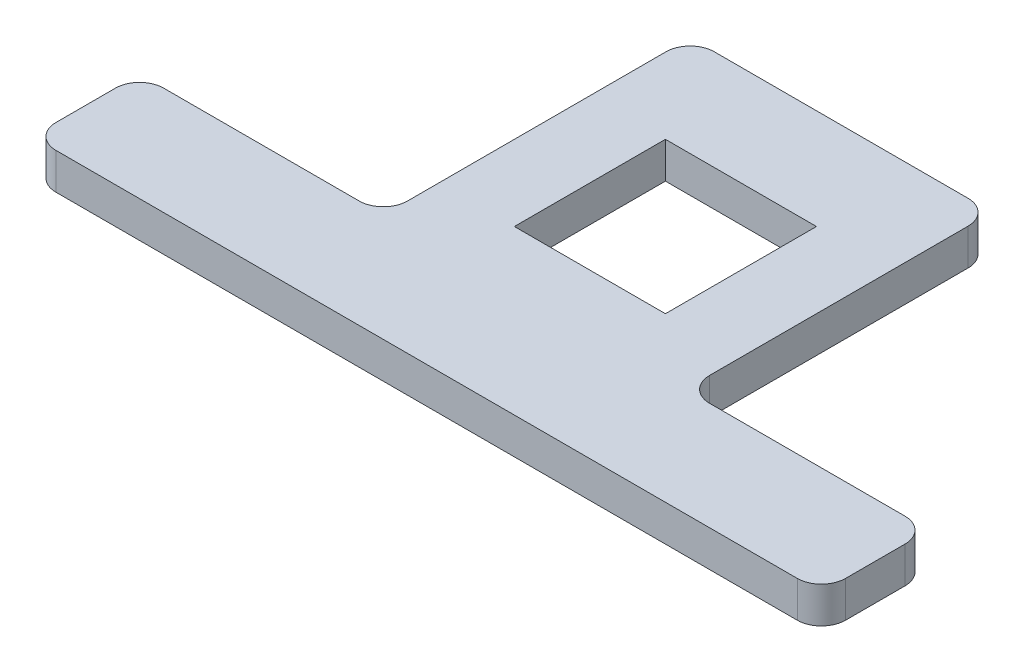
ISO-10303-21;
HEADER;
FILE_DESCRIPTION(('STEP AP214'),'2;1');
FILE_NAME('part.step','',(''),(''),'','','');
FILE_SCHEMA(('AUTOMOTIVE_DESIGN { 1 0 10303 214 1 1 1 1 }'));
ENDSEC;
DATA;
#1=APPLICATION_CONTEXT('core data for automotive mechanical design processes');
#2=APPLICATION_PROTOCOL_DEFINITION('international standard','automotive_design',2000,#1);
#3=PRODUCT_CONTEXT('',#1,'mechanical');
#4=PRODUCT('Part','Part','',(#3));
#5=PRODUCT_RELATED_PRODUCT_CATEGORY('part','',(#4));
#6=PRODUCT_DEFINITION_FORMATION('','',#4);
#7=PRODUCT_DEFINITION_CONTEXT('part definition',#1,'design');
#8=PRODUCT_DEFINITION('design','',#6,#7);
#9=PRODUCT_DEFINITION_SHAPE('','',#8);
#10=(LENGTH_UNIT() NAMED_UNIT(*) SI_UNIT(.MILLI.,.METRE.));
#11=(NAMED_UNIT(*) PLANE_ANGLE_UNIT() SI_UNIT($,.RADIAN.));
#12=(NAMED_UNIT(*) SI_UNIT($,.STERADIAN.) SOLID_ANGLE_UNIT());
#13=UNCERTAINTY_MEASURE_WITH_UNIT(LENGTH_MEASURE(1.E-05),#10,'distance_accuracy_value','');
#14=(GEOMETRIC_REPRESENTATION_CONTEXT(3) GLOBAL_UNCERTAINTY_ASSIGNED_CONTEXT((#13)) GLOBAL_UNIT_ASSIGNED_CONTEXT((#10,
#11,#12)) REPRESENTATION_CONTEXT('',''));
#15=CARTESIAN_POINT('',(0.,0.,0.));
#16=DIRECTION('',(0.,0.,1.));
#17=DIRECTION('',(1.,0.,0.));
#18=AXIS2_PLACEMENT_3D('',#15,#16,#17);
#19=CARTESIAN_POINT('',(65.35,6.,34.3099999999999));
#20=DIRECTION('',(-1.,0.,0.));
#21=DIRECTION('',(0.,0.,1.));
#22=AXIS2_PLACEMENT_3D('',#19,#20,#21);
#23=PLANE('',#22);
#24=DIRECTION('',(0.,0.,-1.));
#25=VECTOR('',#24,1.);
#26=CARTESIAN_POINT('',(65.35,0.,34.3099999999999));
#27=LINE('',#26,#25);
#28=CARTESIAN_POINT('',(65.35,0.,30.3099999999999));
#29=VERTEX_POINT('',#28);
#30=CARTESIAN_POINT('',(65.35,0.,20.4699999999999));
#31=VERTEX_POINT('',#30);
#32=EDGE_CURVE('E222',#29,#31,#27,.T.);
#33=ORIENTED_EDGE('',*,*,#32,.T.);
#34=DIRECTION('',(0.,-1.,0.));
#35=VECTOR('',#34,1.);
#36=CARTESIAN_POINT('',(65.35,6.,20.4699999999999));
#37=LINE('',#36,#35);
#38=CARTESIAN_POINT('',(65.35,6.,20.4699999999999));
#39=VERTEX_POINT('',#38);
#40=EDGE_CURVE('E327',#31,#39,#37,.F.);
#41=ORIENTED_EDGE('',*,*,#40,.T.);
#42=DIRECTION('',(0.,0.,-1.));
#43=VECTOR('',#42,1.);
#44=CARTESIAN_POINT('',(65.35,6.,34.3099999999999));
#45=LINE('',#44,#43);
#46=CARTESIAN_POINT('',(65.35,6.,30.3099999999999));
#47=VERTEX_POINT('',#46);
#48=EDGE_CURVE('E228',#47,#39,#45,.T.);
#49=ORIENTED_EDGE('',*,*,#48,.F.);
#50=DIRECTION('',(0.,-1.,0.));
#51=VECTOR('',#50,1.);
#52=CARTESIAN_POINT('',(65.35,6.,30.3099999999999));
#53=LINE('',#52,#51);
#54=EDGE_CURVE('E323',#47,#29,#53,.T.);
#55=ORIENTED_EDGE('',*,*,#54,.T.);
#56=EDGE_LOOP('',(#33,#41,#49,#55));
#57=FACE_BOUND('',#56,.T.);
#58=ADVANCED_FACE('F42',(#57),#23,.F.);
#59=CARTESIAN_POINT('',(25.,6.,16.4699999999999));
#60=DIRECTION('',(0.,0.,1.));
#61=DIRECTION('',(1.,0.,0.));
#62=AXIS2_PLACEMENT_3D('',#59,#60,#61);
#63=PLANE('',#62);
#64=DIRECTION('',(-1.,0.,0.));
#65=VECTOR('',#64,1.);
#66=CARTESIAN_POINT('',(25.,0.,16.4699999999999));
#67=LINE('',#66,#65);
#68=CARTESIAN_POINT('',(61.35,0.,16.4699999999999));
#69=VERTEX_POINT('',#68);
#70=CARTESIAN_POINT('',(29.,0.,16.4699999999999));
#71=VERTEX_POINT('',#70);
#72=EDGE_CURVE('E265',#69,#71,#67,.T.);
#73=ORIENTED_EDGE('',*,*,#72,.T.);
#74=DIRECTION('',(0.,-1.,0.));
#75=VECTOR('',#74,1.);
#76=CARTESIAN_POINT('',(29.,6.,16.4699999999999));
#77=LINE('',#76,#75);
#78=CARTESIAN_POINT('',(29.,6.,16.4699999999999));
#79=VERTEX_POINT('',#78);
#80=EDGE_CURVE('E302',#71,#79,#77,.F.);
#81=ORIENTED_EDGE('',*,*,#80,.T.);
#82=DIRECTION('',(-1.,0.,0.));
#83=VECTOR('',#82,1.);
#84=CARTESIAN_POINT('',(25.,6.,16.4699999999999));
#85=LINE('',#84,#83);
#86=CARTESIAN_POINT('',(61.35,6.,16.4699999999999));
#87=VERTEX_POINT('',#86);
#88=EDGE_CURVE('E232',#87,#79,#85,.T.);
#89=ORIENTED_EDGE('',*,*,#88,.F.);
#90=DIRECTION('',(0.,-1.,0.));
#91=VECTOR('',#90,1.);
#92=CARTESIAN_POINT('',(61.35,6.,16.4699999999999));
#93=LINE('',#92,#91);
#94=EDGE_CURVE('E298',#87,#69,#93,.T.);
#95=ORIENTED_EDGE('',*,*,#94,.T.);
#96=EDGE_LOOP('',(#73,#81,#89,#95));
#97=FACE_BOUND('',#96,.T.);
#98=ADVANCED_FACE('F440',(#97),#63,.F.);
#99=CARTESIAN_POINT('',(25.,6.,-34.31));
#100=DIRECTION('',(-1.,0.,0.));
#101=DIRECTION('',(0.,0.,1.));
#102=AXIS2_PLACEMENT_3D('',#99,#100,#101);
#103=PLANE('',#102);
#104=DIRECTION('',(0.,0.,-1.));
#105=VECTOR('',#104,1.);
#106=CARTESIAN_POINT('',(25.,6.,-34.31));
#107=LINE('',#106,#105);
#108=CARTESIAN_POINT('',(25.,6.,12.4699999999999));
#109=VERTEX_POINT('',#108);
#110=CARTESIAN_POINT('',(25.,6.,-30.31));
#111=VERTEX_POINT('',#110);
#112=EDGE_CURVE('E237',#109,#111,#107,.T.);
#113=ORIENTED_EDGE('',*,*,#112,.F.);
#114=DIRECTION('',(0.,-1.,0.));
#115=VECTOR('',#114,1.);
#116=CARTESIAN_POINT('',(25.,0.,12.4699999999999));
#117=LINE('',#116,#115);
#118=CARTESIAN_POINT('',(25.,0.,12.4699999999999));
#119=VERTEX_POINT('',#118);
#120=EDGE_CURVE('E294',#109,#119,#117,.T.);
#121=ORIENTED_EDGE('',*,*,#120,.T.);
#122=DIRECTION('',(0.,0.,-1.));
#123=VECTOR('',#122,1.);
#124=CARTESIAN_POINT('',(25.,0.,-34.31));
#125=LINE('',#124,#123);
#126=CARTESIAN_POINT('',(25.,0.,-30.31));
#127=VERTEX_POINT('',#126);
#128=EDGE_CURVE('E269',#119,#127,#125,.T.);
#129=ORIENTED_EDGE('',*,*,#128,.T.);
#130=DIRECTION('',(0.,-1.,0.));
#131=VECTOR('',#130,1.);
#132=CARTESIAN_POINT('',(25.,6.,-30.31));
#133=LINE('',#132,#131);
#134=EDGE_CURVE('E261',#127,#111,#133,.F.);
#135=ORIENTED_EDGE('',*,*,#134,.T.);
#136=EDGE_LOOP('',(#113,#121,#129,#135));
#137=FACE_BOUND('',#136,.T.);
#138=ADVANCED_FACE('F448',(#137),#103,.F.);
#139=CARTESIAN_POINT('',(-25.,6.,-34.31));
#140=DIRECTION('',(0.,0.,1.));
#141=DIRECTION('',(1.,0.,0.));
#142=AXIS2_PLACEMENT_3D('',#139,#140,#141);
#143=PLANE('',#142);
#144=DIRECTION('',(-1.,0.,0.));
#145=VECTOR('',#144,1.);
#146=CARTESIAN_POINT('',(-25.,0.,-34.31));
#147=LINE('',#146,#145);
#148=CARTESIAN_POINT('',(21.,0.,-34.31));
#149=VERTEX_POINT('',#148);
#150=CARTESIAN_POINT('',(-21.,0.,-34.31));
#151=VERTEX_POINT('',#150);
#152=EDGE_CURVE('E273',#149,#151,#147,.T.);
#153=ORIENTED_EDGE('',*,*,#152,.T.);
#154=DIRECTION('',(0.,-1.,0.));
#155=VECTOR('',#154,1.);
#156=CARTESIAN_POINT('',(-21.,6.,-34.31));
#157=LINE('',#156,#155);
#158=CARTESIAN_POINT('',(-21.,6.,-34.31));
#159=VERTEX_POINT('',#158);
#160=EDGE_CURVE('E380',#151,#159,#157,.F.);
#161=ORIENTED_EDGE('',*,*,#160,.T.);
#162=DIRECTION('',(-1.,0.,0.));
#163=VECTOR('',#162,1.);
#164=CARTESIAN_POINT('',(-25.,6.,-34.31));
#165=LINE('',#164,#163);
#166=CARTESIAN_POINT('',(21.,6.,-34.31));
#167=VERTEX_POINT('',#166);
#168=EDGE_CURVE('E241',#167,#159,#165,.T.);
#169=ORIENTED_EDGE('',*,*,#168,.F.);
#170=DIRECTION('',(0.,-1.,0.));
#171=VECTOR('',#170,1.);
#172=CARTESIAN_POINT('',(21.,6.,-34.31));
#173=LINE('',#172,#171);
#174=EDGE_CURVE('E376',#167,#149,#173,.T.);
#175=ORIENTED_EDGE('',*,*,#174,.T.);
#176=EDGE_LOOP('',(#153,#161,#169,#175));
#177=FACE_BOUND('',#176,.T.);
#178=ADVANCED_FACE('F456',(#177),#143,.F.);
#179=CARTESIAN_POINT('',(-25.,6.,16.47));
#180=DIRECTION('',(1.,0.,0.));
#181=DIRECTION('',(0.,0.,-1.));
#182=AXIS2_PLACEMENT_3D('',#179,#180,#181);
#183=PLANE('',#182);
#184=DIRECTION('',(0.,0.,1.));
#185=VECTOR('',#184,1.);
#186=CARTESIAN_POINT('',(-25.,0.,16.47));
#187=LINE('',#186,#185);
#188=CARTESIAN_POINT('',(-25.,0.,-30.31));
#189=VERTEX_POINT('',#188);
#190=CARTESIAN_POINT('',(-25.,0.,12.47));
#191=VERTEX_POINT('',#190);
#192=EDGE_CURVE('E277',#189,#191,#187,.T.);
#193=ORIENTED_EDGE('',*,*,#192,.T.);
#194=DIRECTION('',(0.,-1.,0.));
#195=VECTOR('',#194,1.);
#196=CARTESIAN_POINT('',(-25.,6.,12.47));
#197=LINE('',#196,#195);
#198=CARTESIAN_POINT('',(-25.,6.,12.47));
#199=VERTEX_POINT('',#198);
#200=EDGE_CURVE('E373',#191,#199,#197,.F.);
#201=ORIENTED_EDGE('',*,*,#200,.T.);
#202=DIRECTION('',(0.,0.,1.));
#203=VECTOR('',#202,1.);
#204=CARTESIAN_POINT('',(-25.,6.,16.47));
#205=LINE('',#204,#203);
#206=CARTESIAN_POINT('',(-25.,6.,-30.31));
#207=VERTEX_POINT('',#206);
#208=EDGE_CURVE('E245',#207,#199,#205,.T.);
#209=ORIENTED_EDGE('',*,*,#208,.F.);
#210=DIRECTION('',(0.,-1.,0.));
#211=VECTOR('',#210,1.);
#212=CARTESIAN_POINT('',(-25.,6.,-30.31));
#213=LINE('',#212,#211);
#214=EDGE_CURVE('E369',#207,#189,#213,.T.);
#215=ORIENTED_EDGE('',*,*,#214,.T.);
#216=EDGE_LOOP('',(#193,#201,#209,#215));
#217=FACE_BOUND('',#216,.T.);
#218=ADVANCED_FACE('F396',(#217),#183,.F.);
#219=CARTESIAN_POINT('',(-65.35,6.,16.47));
#220=DIRECTION('',(0.,0.,1.));
#221=DIRECTION('',(1.,0.,0.));
#222=AXIS2_PLACEMENT_3D('',#219,#220,#221);
#223=PLANE('',#222);
#224=DIRECTION('',(-1.,0.,0.));
#225=VECTOR('',#224,1.);
#226=CARTESIAN_POINT('',(-65.35,0.,16.47));
#227=LINE('',#226,#225);
#228=CARTESIAN_POINT('',(-29.,0.,16.47));
#229=VERTEX_POINT('',#228);
#230=CARTESIAN_POINT('',(-61.35,0.,16.47));
#231=VERTEX_POINT('',#230);
#232=EDGE_CURVE('E281',#229,#231,#227,.T.);
#233=ORIENTED_EDGE('',*,*,#232,.T.);
#234=DIRECTION('',(0.,-1.,0.));
#235=VECTOR('',#234,1.);
#236=CARTESIAN_POINT('',(-61.35,6.,16.47));
#237=LINE('',#236,#235);
#238=CARTESIAN_POINT('',(-61.35,6.,16.47));
#239=VERTEX_POINT('',#238);
#240=EDGE_CURVE('E366',#231,#239,#237,.F.);
#241=ORIENTED_EDGE('',*,*,#240,.T.);
#242=DIRECTION('',(-1.,0.,0.));
#243=VECTOR('',#242,1.);
#244=CARTESIAN_POINT('',(-65.35,6.,16.47));
#245=LINE('',#244,#243);
#246=CARTESIAN_POINT('',(-29.,6.,16.47));
#247=VERTEX_POINT('',#246);
#248=EDGE_CURVE('E249',#247,#239,#245,.T.);
#249=ORIENTED_EDGE('',*,*,#248,.F.);
#250=DIRECTION('',(0.,-1.,0.));
#251=VECTOR('',#250,1.);
#252=CARTESIAN_POINT('',(-29.,0.,16.47));
#253=LINE('',#252,#251);
#254=EDGE_CURVE('E362',#247,#229,#253,.T.);
#255=ORIENTED_EDGE('',*,*,#254,.T.);
#256=EDGE_LOOP('',(#233,#241,#249,#255));
#257=FACE_BOUND('',#256,.T.);
#258=ADVANCED_FACE('F406',(#257),#223,.F.);
#259=CARTESIAN_POINT('',(-65.35,6.,34.31));
#260=DIRECTION('',(1.,0.,0.));
#261=DIRECTION('',(0.,0.,-1.));
#262=AXIS2_PLACEMENT_3D('',#259,#260,#261);
#263=PLANE('',#262);
#264=DIRECTION('',(0.,0.,1.));
#265=VECTOR('',#264,1.);
#266=CARTESIAN_POINT('',(-65.35,0.,34.31));
#267=LINE('',#266,#265);
#268=CARTESIAN_POINT('',(-65.35,0.,20.47));
#269=VERTEX_POINT('',#268);
#270=CARTESIAN_POINT('',(-65.35,0.,30.31));
#271=VERTEX_POINT('',#270);
#272=EDGE_CURVE('E285',#269,#271,#267,.T.);
#273=ORIENTED_EDGE('',*,*,#272,.T.);
#274=DIRECTION('',(0.,-1.,0.));
#275=VECTOR('',#274,1.);
#276=CARTESIAN_POINT('',(-65.35,6.,30.31));
#277=LINE('',#276,#275);
#278=CARTESIAN_POINT('',(-65.35,6.,30.31));
#279=VERTEX_POINT('',#278);
#280=EDGE_CURVE('E359',#271,#279,#277,.F.);
#281=ORIENTED_EDGE('',*,*,#280,.T.);
#282=DIRECTION('',(0.,0.,1.));
#283=VECTOR('',#282,1.);
#284=CARTESIAN_POINT('',(-65.35,6.,34.31));
#285=LINE('',#284,#283);
#286=CARTESIAN_POINT('',(-65.35,6.,20.47));
#287=VERTEX_POINT('',#286);
#288=EDGE_CURVE('E253',#287,#279,#285,.T.);
#289=ORIENTED_EDGE('',*,*,#288,.F.);
#290=DIRECTION('',(0.,-1.,0.));
#291=VECTOR('',#290,1.);
#292=CARTESIAN_POINT('',(-65.35,6.,20.47));
#293=LINE('',#292,#291);
#294=EDGE_CURVE('E355',#287,#269,#293,.T.);
#295=ORIENTED_EDGE('',*,*,#294,.T.);
#296=EDGE_LOOP('',(#273,#281,#289,#295));
#297=FACE_BOUND('',#296,.T.);
#298=ADVANCED_FACE('F414',(#297),#263,.F.);
#299=CARTESIAN_POINT('',(-65.35,6.,34.31));
#300=DIRECTION('',(0.,0.,-1.));
#301=DIRECTION('',(-1.,0.,0.));
#302=AXIS2_PLACEMENT_3D('',#299,#300,#301);
#303=PLANE('',#302);
#304=DIRECTION('',(1.,0.,0.));
#305=VECTOR('',#304,1.);
#306=CARTESIAN_POINT('',(-65.35,0.,34.31));
#307=LINE('',#306,#305);
#308=CARTESIAN_POINT('',(-61.35,0.,34.31));
#309=VERTEX_POINT('',#308);
#310=CARTESIAN_POINT('',(61.35,0.,34.3099999999999));
#311=VERTEX_POINT('',#310);
#312=EDGE_CURVE('E233',#309,#311,#307,.T.);
#313=ORIENTED_EDGE('',*,*,#312,.T.);
#314=DIRECTION('',(0.,-1.,0.));
#315=VECTOR('',#314,1.);
#316=CARTESIAN_POINT('',(61.35,6.,34.3099999999999));
#317=LINE('',#316,#315);
#318=CARTESIAN_POINT('',(61.35,6.,34.3099999999999));
#319=VERTEX_POINT('',#318);
#320=EDGE_CURVE('E352',#311,#319,#317,.F.);
#321=ORIENTED_EDGE('',*,*,#320,.T.);
#322=DIRECTION('',(1.,0.,0.));
#323=VECTOR('',#322,1.);
#324=CARTESIAN_POINT('',(-65.35,6.,34.31));
#325=LINE('',#324,#323);
#326=CARTESIAN_POINT('',(-61.35,6.,34.31));
#327=VERTEX_POINT('',#326);
#328=EDGE_CURVE('E257',#327,#319,#325,.T.);
#329=ORIENTED_EDGE('',*,*,#328,.F.);
#330=DIRECTION('',(0.,-1.,0.));
#331=VECTOR('',#330,1.);
#332=CARTESIAN_POINT('',(-61.35,6.,34.31));
#333=LINE('',#332,#331);
#334=EDGE_CURVE('E348',#327,#309,#333,.T.);
#335=ORIENTED_EDGE('',*,*,#334,.T.);
#336=EDGE_LOOP('',(#313,#321,#329,#335));
#337=FACE_BOUND('',#336,.T.);
#338=ADVANCED_FACE('F423',(#337),#303,.F.);
#339=CARTESIAN_POINT('',(0.,6.,0.));
#340=DIRECTION('',(0.,-1.,0.));
#341=DIRECTION('',(0.,0.,-1.));
#342=AXIS2_PLACEMENT_3D('',#339,#340,#341);
#343=PLANE('',#342);
#344=DIRECTION('',(-1.,0.,0.));
#345=VECTOR('',#344,1.);
#346=CARTESIAN_POINT('',(-12.5,6.,-17.7169400091606));
#347=LINE('',#346,#345);
#348=CARTESIAN_POINT('',(12.5,6.,-17.7169400091606));
#349=VERTEX_POINT('',#348);
#350=CARTESIAN_POINT('',(-12.5,6.,-17.7169400091606));
#351=VERTEX_POINT('',#350);
#352=EDGE_CURVE('E213',#349,#351,#347,.T.);
#353=ORIENTED_EDGE('',*,*,#352,.F.);
#354=DIRECTION('',(0.,0.,-1.));
#355=VECTOR('',#354,1.);
#356=CARTESIAN_POINT('',(12.5,6.,7.28305999083945));
#357=LINE('',#356,#355);
#358=CARTESIAN_POINT('',(12.5,6.,7.28305999083945));
#359=VERTEX_POINT('',#358);
#360=EDGE_CURVE('E58',#359,#349,#357,.T.);
#361=ORIENTED_EDGE('',*,*,#360,.F.);
#362=DIRECTION('',(1.,0.,0.));
#363=VECTOR('',#362,1.);
#364=CARTESIAN_POINT('',(-12.5,6.,7.28305999083945));
#365=LINE('',#364,#363);
#366=CARTESIAN_POINT('',(-12.5,6.,7.28305999083945));
#367=VERTEX_POINT('',#366);
#368=EDGE_CURVE('E200',#367,#359,#365,.T.);
#369=ORIENTED_EDGE('',*,*,#368,.F.);
#370=DIRECTION('',(0.,0.,1.));
#371=VECTOR('',#370,1.);
#372=CARTESIAN_POINT('',(-12.5,6.,7.28305999083945));
#373=LINE('',#372,#371);
#374=EDGE_CURVE('E204',#351,#367,#373,.T.);
#375=ORIENTED_EDGE('',*,*,#374,.F.);
#376=EDGE_LOOP('',(#353,#361,#369,#375));
#377=FACE_BOUND('',#376,.T.);
#378=ORIENTED_EDGE('',*,*,#48,.T.);
#379=CARTESIAN_POINT('',(61.35,6.,20.4699999999999));
#380=DIRECTION('',(0.,-1.,0.));
#381=DIRECTION('',(0.,0.,-1.));
#382=AXIS2_PLACEMENT_3D('',#379,#380,#381);
#383=CIRCLE('',#382,4.);
#384=EDGE_CURVE('E345',#39,#87,#383,.F.);
#385=ORIENTED_EDGE('',*,*,#384,.T.);
#386=ORIENTED_EDGE('',*,*,#88,.T.);
#387=CARTESIAN_POINT('',(29.,6.,12.4699999999999));
#388=DIRECTION('',(0.,-1.,0.));
#389=DIRECTION('',(0.,0.,-1.));
#390=AXIS2_PLACEMENT_3D('',#387,#388,#389);
#391=CIRCLE('',#390,4.);
#392=EDGE_CURVE('E386',#79,#109,#391,.T.);
#393=ORIENTED_EDGE('',*,*,#392,.T.);
#394=ORIENTED_EDGE('',*,*,#112,.T.);
#395=CARTESIAN_POINT('',(21.,6.,-30.31));
#396=DIRECTION('',(0.,-1.,0.));
#397=DIRECTION('',(0.,0.,-1.));
#398=AXIS2_PLACEMENT_3D('',#395,#396,#397);
#399=CIRCLE('',#398,4.);
#400=EDGE_CURVE('E330',#111,#167,#399,.F.);
#401=ORIENTED_EDGE('',*,*,#400,.T.);
#402=ORIENTED_EDGE('',*,*,#168,.T.);
#403=CARTESIAN_POINT('',(-21.,6.,-30.31));
#404=DIRECTION('',(0.,-1.,0.));
#405=DIRECTION('',(0.,0.,-1.));
#406=AXIS2_PLACEMENT_3D('',#403,#404,#405);
#407=CIRCLE('',#406,4.);
#408=EDGE_CURVE('E333',#159,#207,#407,.F.);
#409=ORIENTED_EDGE('',*,*,#408,.T.);
#410=ORIENTED_EDGE('',*,*,#208,.T.);
#411=CARTESIAN_POINT('',(-29.,6.,12.47));
#412=DIRECTION('',(0.,-1.,0.));
#413=DIRECTION('',(0.,0.,-1.));
#414=AXIS2_PLACEMENT_3D('',#411,#412,#413);
#415=CIRCLE('',#414,4.);
#416=EDGE_CURVE('E11',#199,#247,#415,.T.);
#417=ORIENTED_EDGE('',*,*,#416,.T.);
#418=ORIENTED_EDGE('',*,*,#248,.T.);
#419=CARTESIAN_POINT('',(-61.35,6.,20.47));
#420=DIRECTION('',(0.,-1.,0.));
#421=DIRECTION('',(0.,0.,-1.));
#422=AXIS2_PLACEMENT_3D('',#419,#420,#421);
#423=CIRCLE('',#422,4.);
#424=EDGE_CURVE('E336',#239,#287,#423,.F.);
#425=ORIENTED_EDGE('',*,*,#424,.T.);
#426=ORIENTED_EDGE('',*,*,#288,.T.);
#427=CARTESIAN_POINT('',(-61.35,6.,30.31));
#428=DIRECTION('',(0.,-1.,0.));
#429=DIRECTION('',(0.,0.,-1.));
#430=AXIS2_PLACEMENT_3D('',#427,#428,#429);
#431=CIRCLE('',#430,4.);
#432=EDGE_CURVE('E339',#279,#327,#431,.F.);
#433=ORIENTED_EDGE('',*,*,#432,.T.);
#434=ORIENTED_EDGE('',*,*,#328,.T.);
#435=CARTESIAN_POINT('',(61.35,6.,30.3099999999999));
#436=DIRECTION('',(0.,-1.,0.));
#437=DIRECTION('',(0.,0.,-1.));
#438=AXIS2_PLACEMENT_3D('',#435,#436,#437);
#439=CIRCLE('',#438,4.);
#440=EDGE_CURVE('E342',#319,#47,#439,.F.);
#441=ORIENTED_EDGE('',*,*,#440,.T.);
#442=EDGE_LOOP('',(#378,#385,#386,#393,#394,#401,#402,#409,#410,#417,#418,#425,#426,#433,#434,#441));
#443=FACE_BOUND('',#442,.T.);
#444=ADVANCED_FACE('F403',(#377,#443),#343,.F.);
#445=CARTESIAN_POINT('',(0.,0.,0.));
#446=DIRECTION('',(0.,-1.,0.));
#447=DIRECTION('',(0.,0.,-1.));
#448=AXIS2_PLACEMENT_3D('',#445,#446,#447);
#449=PLANE('',#448);
#450=DIRECTION('',(0.,0.,-1.));
#451=VECTOR('',#450,1.);
#452=CARTESIAN_POINT('',(12.5,0.,7.28305999083945));
#453=LINE('',#452,#451);
#454=CARTESIAN_POINT('',(12.5,0.,7.28305999083945));
#455=VERTEX_POINT('',#454);
#456=CARTESIAN_POINT('',(12.5,0.,-17.7169400091606));
#457=VERTEX_POINT('',#456);
#458=EDGE_CURVE('E181',#455,#457,#453,.T.);
#459=ORIENTED_EDGE('',*,*,#458,.T.);
#460=DIRECTION('',(-1.,0.,0.));
#461=VECTOR('',#460,1.);
#462=CARTESIAN_POINT('',(-12.5,0.,-17.7169400091606));
#463=LINE('',#462,#461);
#464=CARTESIAN_POINT('',(-12.5,0.,-17.7169400091606));
#465=VERTEX_POINT('',#464);
#466=EDGE_CURVE('E191',#457,#465,#463,.T.);
#467=ORIENTED_EDGE('',*,*,#466,.T.);
#468=DIRECTION('',(0.,0.,1.));
#469=VECTOR('',#468,1.);
#470=CARTESIAN_POINT('',(-12.5,0.,7.28305999083945));
#471=LINE('',#470,#469);
#472=CARTESIAN_POINT('',(-12.5,0.,7.28305999083945));
#473=VERTEX_POINT('',#472);
#474=EDGE_CURVE('E66',#465,#473,#471,.T.);
#475=ORIENTED_EDGE('',*,*,#474,.T.);
#476=DIRECTION('',(1.,0.,0.));
#477=VECTOR('',#476,1.);
#478=CARTESIAN_POINT('',(-12.5,0.,7.28305999083945));
#479=LINE('',#478,#477);
#480=EDGE_CURVE('E188',#473,#455,#479,.T.);
#481=ORIENTED_EDGE('',*,*,#480,.T.);
#482=EDGE_LOOP('',(#459,#467,#475,#481));
#483=FACE_BOUND('',#482,.T.);
#484=ORIENTED_EDGE('',*,*,#72,.F.);
#485=CARTESIAN_POINT('',(61.35,0.,20.4699999999999));
#486=DIRECTION('',(0.,-1.,0.));
#487=DIRECTION('',(0.,0.,-1.));
#488=AXIS2_PLACEMENT_3D('',#485,#486,#487);
#489=CIRCLE('',#488,4.);
#490=EDGE_CURVE('E320',#69,#31,#489,.T.);
#491=ORIENTED_EDGE('',*,*,#490,.T.);
#492=ORIENTED_EDGE('',*,*,#32,.F.);
#493=CARTESIAN_POINT('',(61.35,0.,30.3099999999999));
#494=DIRECTION('',(0.,-1.,0.));
#495=DIRECTION('',(0.,0.,-1.));
#496=AXIS2_PLACEMENT_3D('',#493,#494,#495);
#497=CIRCLE('',#496,4.);
#498=EDGE_CURVE('E317',#29,#311,#497,.T.);
#499=ORIENTED_EDGE('',*,*,#498,.T.);
#500=ORIENTED_EDGE('',*,*,#312,.F.);
#501=CARTESIAN_POINT('',(-61.35,0.,30.31));
#502=DIRECTION('',(0.,-1.,0.));
#503=DIRECTION('',(0.,0.,-1.));
#504=AXIS2_PLACEMENT_3D('',#501,#502,#503);
#505=CIRCLE('',#504,4.);
#506=EDGE_CURVE('E314',#309,#271,#505,.T.);
#507=ORIENTED_EDGE('',*,*,#506,.T.);
#508=ORIENTED_EDGE('',*,*,#272,.F.);
#509=CARTESIAN_POINT('',(-61.35,0.,20.47));
#510=DIRECTION('',(0.,-1.,0.));
#511=DIRECTION('',(0.,0.,-1.));
#512=AXIS2_PLACEMENT_3D('',#509,#510,#511);
#513=CIRCLE('',#512,4.);
#514=EDGE_CURVE('E311',#269,#231,#513,.T.);
#515=ORIENTED_EDGE('',*,*,#514,.T.);
#516=ORIENTED_EDGE('',*,*,#232,.F.);
#517=CARTESIAN_POINT('',(-29.,0.,12.47));
#518=DIRECTION('',(0.,-1.,0.));
#519=DIRECTION('',(0.,0.,-1.));
#520=AXIS2_PLACEMENT_3D('',#517,#518,#519);
#521=CIRCLE('',#520,4.);
#522=EDGE_CURVE('E51',#229,#191,#521,.F.);
#523=ORIENTED_EDGE('',*,*,#522,.T.);
#524=ORIENTED_EDGE('',*,*,#192,.F.);
#525=CARTESIAN_POINT('',(-21.,0.,-30.31));
#526=DIRECTION('',(0.,-1.,0.));
#527=DIRECTION('',(0.,0.,-1.));
#528=AXIS2_PLACEMENT_3D('',#525,#526,#527);
#529=CIRCLE('',#528,4.);
#530=EDGE_CURVE('E308',#189,#151,#529,.T.);
#531=ORIENTED_EDGE('',*,*,#530,.T.);
#532=ORIENTED_EDGE('',*,*,#152,.F.);
#533=CARTESIAN_POINT('',(21.,0.,-30.31));
#534=DIRECTION('',(0.,-1.,0.));
#535=DIRECTION('',(0.,0.,-1.));
#536=AXIS2_PLACEMENT_3D('',#533,#534,#535);
#537=CIRCLE('',#536,4.);
#538=EDGE_CURVE('E305',#149,#127,#537,.T.);
#539=ORIENTED_EDGE('',*,*,#538,.T.);
#540=ORIENTED_EDGE('',*,*,#128,.F.);
#541=CARTESIAN_POINT('',(29.,0.,12.4699999999999));
#542=DIRECTION('',(0.,-1.,0.));
#543=DIRECTION('',(0.,0.,-1.));
#544=AXIS2_PLACEMENT_3D('',#541,#542,#543);
#545=CIRCLE('',#544,4.);
#546=EDGE_CURVE('E383',#119,#71,#545,.F.);
#547=ORIENTED_EDGE('',*,*,#546,.T.);
#548=EDGE_LOOP('',(#484,#491,#492,#499,#500,#507,#508,#515,#516,#523,#524,#531,#532,#539,#540,#547));
#549=FACE_BOUND('',#548,.T.);
#550=ADVANCED_FACE('F196',(#483,#549),#449,.T.);
#551=CARTESIAN_POINT('',(29.,6.,12.4699999999999));
#552=DIRECTION('',(0.,1.,0.));
#553=DIRECTION('',(0.,0.,1.));
#554=AXIS2_PLACEMENT_3D('',#551,#552,#553);
#555=CYLINDRICAL_SURFACE('',#554,4.);
#556=ORIENTED_EDGE('',*,*,#392,.F.);
#557=ORIENTED_EDGE('',*,*,#80,.F.);
#558=ORIENTED_EDGE('',*,*,#546,.F.);
#559=ORIENTED_EDGE('',*,*,#120,.F.);
#560=EDGE_LOOP('',(#556,#557,#558,#559));
#561=FACE_BOUND('',#560,.T.);
#562=ADVANCED_FACE('F443',(#561),#555,.F.);
#563=CARTESIAN_POINT('',(61.35,6.,20.4699999999999));
#564=DIRECTION('',(0.,-1.,0.));
#565=DIRECTION('',(0.,0.,-1.));
#566=AXIS2_PLACEMENT_3D('',#563,#564,#565);
#567=CYLINDRICAL_SURFACE('',#566,4.);
#568=ORIENTED_EDGE('',*,*,#384,.F.);
#569=ORIENTED_EDGE('',*,*,#40,.F.);
#570=ORIENTED_EDGE('',*,*,#490,.F.);
#571=ORIENTED_EDGE('',*,*,#94,.F.);
#572=EDGE_LOOP('',(#568,#569,#570,#571));
#573=FACE_BOUND('',#572,.T.);
#574=ADVANCED_FACE('F435',(#573),#567,.T.);
#575=CARTESIAN_POINT('',(61.35,6.,30.3099999999999));
#576=DIRECTION('',(0.,-1.,0.));
#577=DIRECTION('',(0.,0.,-1.));
#578=AXIS2_PLACEMENT_3D('',#575,#576,#577);
#579=CYLINDRICAL_SURFACE('',#578,4.);
#580=ORIENTED_EDGE('',*,*,#440,.F.);
#581=ORIENTED_EDGE('',*,*,#320,.F.);
#582=ORIENTED_EDGE('',*,*,#498,.F.);
#583=ORIENTED_EDGE('',*,*,#54,.F.);
#584=EDGE_LOOP('',(#580,#581,#582,#583));
#585=FACE_BOUND('',#584,.T.);
#586=ADVANCED_FACE('F427',(#585),#579,.T.);
#587=CARTESIAN_POINT('',(-61.35,6.,30.31));
#588=DIRECTION('',(0.,-1.,0.));
#589=DIRECTION('',(0.,0.,-1.));
#590=AXIS2_PLACEMENT_3D('',#587,#588,#589);
#591=CYLINDRICAL_SURFACE('',#590,4.);
#592=ORIENTED_EDGE('',*,*,#432,.F.);
#593=ORIENTED_EDGE('',*,*,#280,.F.);
#594=ORIENTED_EDGE('',*,*,#506,.F.);
#595=ORIENTED_EDGE('',*,*,#334,.F.);
#596=EDGE_LOOP('',(#592,#593,#594,#595));
#597=FACE_BOUND('',#596,.T.);
#598=ADVANCED_FACE('F418',(#597),#591,.T.);
#599=CARTESIAN_POINT('',(-61.35,6.,20.47));
#600=DIRECTION('',(0.,-1.,0.));
#601=DIRECTION('',(0.,0.,-1.));
#602=AXIS2_PLACEMENT_3D('',#599,#600,#601);
#603=CYLINDRICAL_SURFACE('',#602,4.);
#604=ORIENTED_EDGE('',*,*,#424,.F.);
#605=ORIENTED_EDGE('',*,*,#240,.F.);
#606=ORIENTED_EDGE('',*,*,#514,.F.);
#607=ORIENTED_EDGE('',*,*,#294,.F.);
#608=EDGE_LOOP('',(#604,#605,#606,#607));
#609=FACE_BOUND('',#608,.T.);
#610=ADVANCED_FACE('F409',(#609),#603,.T.);
#611=CARTESIAN_POINT('',(-29.,6.,12.47));
#612=DIRECTION('',(0.,1.,0.));
#613=DIRECTION('',(0.,0.,1.));
#614=AXIS2_PLACEMENT_3D('',#611,#612,#613);
#615=CYLINDRICAL_SURFACE('',#614,4.);
#616=ORIENTED_EDGE('',*,*,#416,.F.);
#617=ORIENTED_EDGE('',*,*,#200,.F.);
#618=ORIENTED_EDGE('',*,*,#522,.F.);
#619=ORIENTED_EDGE('',*,*,#254,.F.);
#620=EDGE_LOOP('',(#616,#617,#618,#619));
#621=FACE_BOUND('',#620,.T.);
#622=ADVANCED_FACE('F400',(#621),#615,.F.);
#623=CARTESIAN_POINT('',(-21.,6.,-30.31));
#624=DIRECTION('',(0.,-1.,0.));
#625=DIRECTION('',(0.,0.,-1.));
#626=AXIS2_PLACEMENT_3D('',#623,#624,#625);
#627=CYLINDRICAL_SURFACE('',#626,4.);
#628=ORIENTED_EDGE('',*,*,#408,.F.);
#629=ORIENTED_EDGE('',*,*,#160,.F.);
#630=ORIENTED_EDGE('',*,*,#530,.F.);
#631=ORIENTED_EDGE('',*,*,#214,.F.);
#632=EDGE_LOOP('',(#628,#629,#630,#631));
#633=FACE_BOUND('',#632,.T.);
#634=ADVANCED_FACE('F460',(#633),#627,.T.);
#635=CARTESIAN_POINT('',(21.,6.,-30.31));
#636=DIRECTION('',(0.,-1.,0.));
#637=DIRECTION('',(0.,0.,-1.));
#638=AXIS2_PLACEMENT_3D('',#635,#636,#637);
#639=CYLINDRICAL_SURFACE('',#638,4.);
#640=ORIENTED_EDGE('',*,*,#400,.F.);
#641=ORIENTED_EDGE('',*,*,#134,.F.);
#642=ORIENTED_EDGE('',*,*,#538,.F.);
#643=ORIENTED_EDGE('',*,*,#174,.F.);
#644=EDGE_LOOP('',(#640,#641,#642,#643));
#645=FACE_BOUND('',#644,.T.);
#646=ADVANCED_FACE('F44',(#645),#639,.T.);
#647=CARTESIAN_POINT('',(12.5,0.,7.28305999083945));
#648=DIRECTION('',(1.,0.,0.));
#649=DIRECTION('',(0.,0.,-1.));
#650=AXIS2_PLACEMENT_3D('',#647,#648,#649);
#651=PLANE('',#650);
#652=ORIENTED_EDGE('',*,*,#360,.T.);
#653=DIRECTION('',(0.,1.,0.));
#654=VECTOR('',#653,1.);
#655=CARTESIAN_POINT('',(12.5,0.,-17.7169400091606));
#656=LINE('',#655,#654);
#657=EDGE_CURVE('E177',#457,#349,#656,.T.);
#658=ORIENTED_EDGE('',*,*,#657,.F.);
#659=ORIENTED_EDGE('',*,*,#458,.F.);
#660=DIRECTION('',(0.,1.,0.));
#661=VECTOR('',#660,1.);
#662=CARTESIAN_POINT('',(12.5,0.,7.28305999083945));
#663=LINE('',#662,#661);
#664=EDGE_CURVE('E219',#455,#359,#663,.T.);
#665=ORIENTED_EDGE('',*,*,#664,.T.);
#666=EDGE_LOOP('',(#652,#658,#659,#665));
#667=FACE_BOUND('',#666,.T.);
#668=ADVANCED_FACE('F179',(#667),#651,.F.);
#669=CARTESIAN_POINT('',(-12.5,0.,7.28305999083945));
#670=DIRECTION('',(0.,0.,1.));
#671=DIRECTION('',(1.,0.,0.));
#672=AXIS2_PLACEMENT_3D('',#669,#670,#671);
#673=PLANE('',#672);
#674=ORIENTED_EDGE('',*,*,#368,.T.);
#675=ORIENTED_EDGE('',*,*,#664,.F.);
#676=ORIENTED_EDGE('',*,*,#480,.F.);
#677=DIRECTION('',(0.,1.,0.));
#678=VECTOR('',#677,1.);
#679=CARTESIAN_POINT('',(-12.5,0.,7.28305999083945));
#680=LINE('',#679,#678);
#681=EDGE_CURVE('E223',#473,#367,#680,.T.);
#682=ORIENTED_EDGE('',*,*,#681,.T.);
#683=EDGE_LOOP('',(#674,#675,#676,#682));
#684=FACE_BOUND('',#683,.T.);
#685=ADVANCED_FACE('F528',(#684),#673,.F.);
#686=CARTESIAN_POINT('',(-12.5,0.,7.28305999083945));
#687=DIRECTION('',(-1.,0.,0.));
#688=DIRECTION('',(0.,0.,1.));
#689=AXIS2_PLACEMENT_3D('',#686,#687,#688);
#690=PLANE('',#689);
#691=ORIENTED_EDGE('',*,*,#374,.T.);
#692=ORIENTED_EDGE('',*,*,#681,.F.);
#693=ORIENTED_EDGE('',*,*,#474,.F.);
#694=DIRECTION('',(0.,1.,0.));
#695=VECTOR('',#694,1.);
#696=CARTESIAN_POINT('',(-12.5,0.,-17.7169400091606));
#697=LINE('',#696,#695);
#698=EDGE_CURVE('E187',#465,#351,#697,.T.);
#699=ORIENTED_EDGE('',*,*,#698,.T.);
#700=EDGE_LOOP('',(#691,#692,#693,#699));
#701=FACE_BOUND('',#700,.T.);
#702=ADVANCED_FACE('F538',(#701),#690,.F.);
#703=CARTESIAN_POINT('',(-12.5,0.,-17.7169400091606));
#704=DIRECTION('',(0.,0.,-1.));
#705=DIRECTION('',(-1.,0.,0.));
#706=AXIS2_PLACEMENT_3D('',#703,#704,#705);
#707=PLANE('',#706);
#708=ORIENTED_EDGE('',*,*,#352,.T.);
#709=ORIENTED_EDGE('',*,*,#698,.F.);
#710=ORIENTED_EDGE('',*,*,#466,.F.);
#711=ORIENTED_EDGE('',*,*,#657,.T.);
#712=EDGE_LOOP('',(#708,#709,#710,#711));
#713=FACE_BOUND('',#712,.T.);
#714=ADVANCED_FACE('F192',(#713),#707,.F.);
#715=CLOSED_SHELL('',(#58,#98,#138,#178,#218,#258,#298,#338,#444,#550,#562,#574,#586,#598,#610,
#622,#634,#646,#668,#685,#702,#714));
#716=MANIFOLD_SOLID_BREP('B2',#715);
#717=ADVANCED_BREP_SHAPE_REPRESENTATION('',(#18,#716),#14);
#718=SHAPE_DEFINITION_REPRESENTATION(#9,#717);
ENDSEC;
END-ISO-10303-21;
